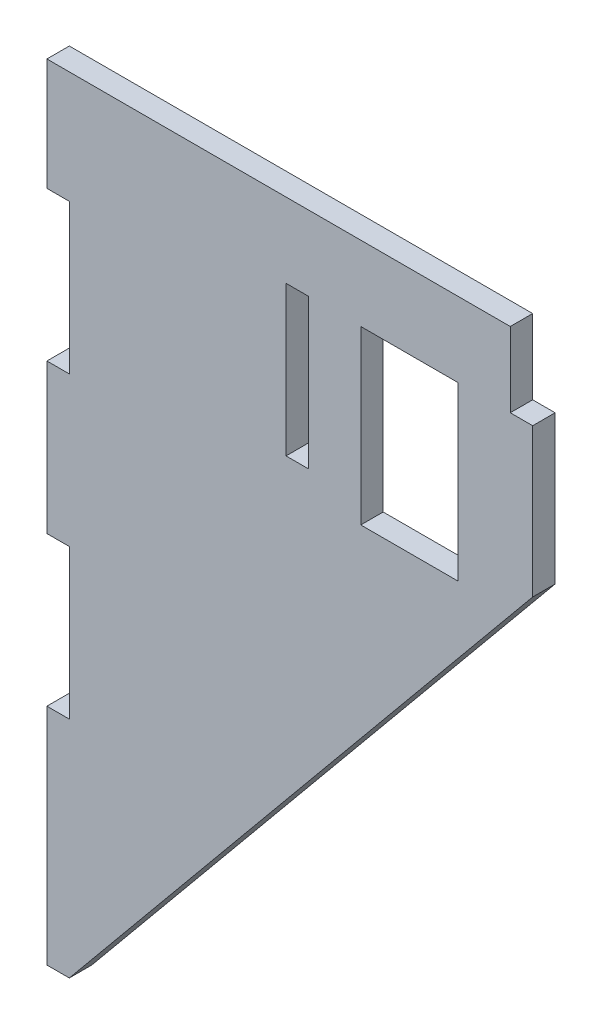
ISO-10303-21;
HEADER;
FILE_DESCRIPTION(('STEP AP214'),'2;1');
FILE_NAME('part.step','',(''),(''),'','','');
FILE_SCHEMA(('AUTOMOTIVE_DESIGN { 1 0 10303 214 1 1 1 1 }'));
ENDSEC;
DATA;
#1=APPLICATION_CONTEXT('core data for automotive mechanical design processes');
#2=APPLICATION_PROTOCOL_DEFINITION('international standard','automotive_design',2000,#1);
#3=PRODUCT_CONTEXT('',#1,'mechanical');
#4=PRODUCT('Part','Part','',(#3));
#5=PRODUCT_RELATED_PRODUCT_CATEGORY('part','',(#4));
#6=PRODUCT_DEFINITION_FORMATION('','',#4);
#7=PRODUCT_DEFINITION_CONTEXT('part definition',#1,'design');
#8=PRODUCT_DEFINITION('design','',#6,#7);
#9=PRODUCT_DEFINITION_SHAPE('','',#8);
#10=(LENGTH_UNIT() NAMED_UNIT(*) SI_UNIT(.MILLI.,.METRE.));
#11=(NAMED_UNIT(*) PLANE_ANGLE_UNIT() SI_UNIT($,.RADIAN.));
#12=(NAMED_UNIT(*) SI_UNIT($,.STERADIAN.) SOLID_ANGLE_UNIT());
#13=UNCERTAINTY_MEASURE_WITH_UNIT(LENGTH_MEASURE(1.E-05),#10,'distance_accuracy_value','');
#14=(GEOMETRIC_REPRESENTATION_CONTEXT(3) GLOBAL_UNCERTAINTY_ASSIGNED_CONTEXT((#13)) GLOBAL_UNIT_ASSIGNED_CONTEXT((#10,
#11,#12)) REPRESENTATION_CONTEXT('',''));
#15=CARTESIAN_POINT('',(0.,0.,0.));
#16=DIRECTION('',(0.,0.,1.));
#17=DIRECTION('',(1.,0.,0.));
#18=AXIS2_PLACEMENT_3D('',#15,#16,#17);
#19=CARTESIAN_POINT('',(0.,0.,3.));
#20=DIRECTION('',(0.,0.,-1.));
#21=DIRECTION('',(-1.,0.,0.));
#22=AXIS2_PLACEMENT_3D('',#19,#20,#21);
#23=PLANE('',#22);
#24=DIRECTION('',(0.,1.,0.));
#25=VECTOR('',#24,1.);
#26=CARTESIAN_POINT('',(32.,75.,3.));
#27=LINE('',#26,#25);
#28=CARTESIAN_POINT('',(32.,75.,3.));
#29=VERTEX_POINT('',#28);
#30=CARTESIAN_POINT('',(32.,95.,3.));
#31=VERTEX_POINT('',#30);
#32=EDGE_CURVE('E223',#29,#31,#27,.T.);
#33=ORIENTED_EDGE('',*,*,#32,.F.);
#34=DIRECTION('',(1.,0.,0.));
#35=VECTOR('',#34,1.);
#36=CARTESIAN_POINT('',(32.,75.,3.));
#37=LINE('',#36,#35);
#38=CARTESIAN_POINT('',(29.,75.,3.));
#39=VERTEX_POINT('',#38);
#40=EDGE_CURVE('E231',#39,#29,#37,.T.);
#41=ORIENTED_EDGE('',*,*,#40,.F.);
#42=DIRECTION('',(0.,-1.,0.));
#43=VECTOR('',#42,1.);
#44=CARTESIAN_POINT('',(29.,75.,3.));
#45=LINE('',#44,#43);
#46=CARTESIAN_POINT('',(29.,95.,3.));
#47=VERTEX_POINT('',#46);
#48=EDGE_CURVE('E228',#47,#39,#45,.T.);
#49=ORIENTED_EDGE('',*,*,#48,.F.);
#50=DIRECTION('',(-1.,0.,0.));
#51=VECTOR('',#50,1.);
#52=CARTESIAN_POINT('',(29.,95.,3.));
#53=LINE('',#52,#51);
#54=EDGE_CURVE('E225',#31,#47,#53,.T.);
#55=ORIENTED_EDGE('',*,*,#54,.F.);
#56=EDGE_LOOP('',(#33,#41,#49,#55));
#57=FACE_BOUND('',#56,.T.);
#58=DIRECTION('',(1.,0.,0.));
#59=VECTOR('',#58,1.);
#60=CARTESIAN_POINT('',(-3.00000000000001,50.,3.));
#61=LINE('',#60,#59);
#62=CARTESIAN_POINT('',(-3.00000000000001,50.,3.));
#63=VERTEX_POINT('',#62);
#64=CARTESIAN_POINT('',(0.,50.,3.));
#65=VERTEX_POINT('',#64);
#66=EDGE_CURVE('E254',#63,#65,#61,.T.);
#67=ORIENTED_EDGE('',*,*,#66,.T.);
#68=DIRECTION('',(0.,-1.,0.));
#69=VECTOR('',#68,1.);
#70=CARTESIAN_POINT('',(0.,50.,3.));
#71=LINE('',#70,#69);
#72=CARTESIAN_POINT('',(0.,30.,3.));
#73=VERTEX_POINT('',#72);
#74=EDGE_CURVE('E257',#65,#73,#71,.T.);
#75=ORIENTED_EDGE('',*,*,#74,.T.);
#76=DIRECTION('',(-1.,0.,0.));
#77=VECTOR('',#76,1.);
#78=CARTESIAN_POINT('',(0.,30.,3.));
#79=LINE('',#78,#77);
#80=CARTESIAN_POINT('',(-3.00000000000001,30.,3.));
#81=VERTEX_POINT('',#80);
#82=EDGE_CURVE('E260',#73,#81,#79,.T.);
#83=ORIENTED_EDGE('',*,*,#82,.T.);
#84=DIRECTION('',(0.,-1.,0.));
#85=VECTOR('',#84,1.);
#86=CARTESIAN_POINT('',(-3.00000000000001,30.,3.));
#87=LINE('',#86,#85);
#88=CARTESIAN_POINT('',(-3.,0.,3.));
#89=VERTEX_POINT('',#88);
#90=EDGE_CURVE('E262',#81,#89,#87,.T.);
#91=ORIENTED_EDGE('',*,*,#90,.T.);
#92=DIRECTION('',(1.,0.,0.));
#93=VECTOR('',#92,1.);
#94=CARTESIAN_POINT('',(-3.,0.,3.));
#95=LINE('',#94,#93);
#96=CARTESIAN_POINT('',(0.,0.,3.));
#97=VERTEX_POINT('',#96);
#98=EDGE_CURVE('E264',#89,#97,#95,.T.);
#99=ORIENTED_EDGE('',*,*,#98,.T.);
#100=DIRECTION('',(0.636382954795564,0.771373278540077,0.));
#101=VECTOR('',#100,1.);
#102=CARTESIAN_POINT('',(0.,0.,3.));
#103=LINE('',#102,#101);
#104=CARTESIAN_POINT('',(62.,75.1515151515151,3.));
#105=VERTEX_POINT('',#104);
#106=EDGE_CURVE('E266',#97,#105,#103,.T.);
#107=ORIENTED_EDGE('',*,*,#106,.T.);
#108=DIRECTION('',(0.,1.,0.));
#109=VECTOR('',#108,1.);
#110=CARTESIAN_POINT('',(62.,94.9999999999999,3.));
#111=LINE('',#110,#109);
#112=CARTESIAN_POINT('',(62.,94.9999999999999,3.));
#113=VERTEX_POINT('',#112);
#114=EDGE_CURVE('E268',#105,#113,#111,.T.);
#115=ORIENTED_EDGE('',*,*,#114,.T.);
#116=DIRECTION('',(-1.,0.,0.));
#117=VECTOR('',#116,1.);
#118=CARTESIAN_POINT('',(59.,94.9999999999999,3.));
#119=LINE('',#118,#117);
#120=CARTESIAN_POINT('',(59.,94.9999999999999,3.));
#121=VERTEX_POINT('',#120);
#122=EDGE_CURVE('E270',#113,#121,#119,.T.);
#123=ORIENTED_EDGE('',*,*,#122,.T.);
#124=DIRECTION('',(0.,1.,0.));
#125=VECTOR('',#124,1.);
#126=CARTESIAN_POINT('',(59.,105.,3.));
#127=LINE('',#126,#125);
#128=CARTESIAN_POINT('',(59.,105.,3.));
#129=VERTEX_POINT('',#128);
#130=EDGE_CURVE('E272',#121,#129,#127,.T.);
#131=ORIENTED_EDGE('',*,*,#130,.T.);
#132=DIRECTION('',(-1.,0.,0.));
#133=VECTOR('',#132,1.);
#134=CARTESIAN_POINT('',(15.,105.,3.));
#135=LINE('',#134,#133);
#136=CARTESIAN_POINT('',(-3.00000000000001,105.,3.));
#137=VERTEX_POINT('',#136);
#138=EDGE_CURVE('E274',#129,#137,#135,.T.);
#139=ORIENTED_EDGE('',*,*,#138,.T.);
#140=DIRECTION('',(0.,-1.,0.));
#141=VECTOR('',#140,1.);
#142=CARTESIAN_POINT('',(-3.00000000000001,90.,3.));
#143=LINE('',#142,#141);
#144=CARTESIAN_POINT('',(-3.00000000000001,90.,3.));
#145=VERTEX_POINT('',#144);
#146=EDGE_CURVE('E276',#137,#145,#143,.T.);
#147=ORIENTED_EDGE('',*,*,#146,.T.);
#148=DIRECTION('',(1.,0.,0.));
#149=VECTOR('',#148,1.);
#150=CARTESIAN_POINT('',(0.,90.,3.));
#151=LINE('',#150,#149);
#152=CARTESIAN_POINT('',(0.,90.,3.));
#153=VERTEX_POINT('',#152);
#154=EDGE_CURVE('E278',#145,#153,#151,.T.);
#155=ORIENTED_EDGE('',*,*,#154,.T.);
#156=DIRECTION('',(0.,-1.,0.));
#157=VECTOR('',#156,1.);
#158=CARTESIAN_POINT('',(0.,70.,3.));
#159=LINE('',#158,#157);
#160=CARTESIAN_POINT('',(0.,70.,3.));
#161=VERTEX_POINT('',#160);
#162=EDGE_CURVE('E280',#153,#161,#159,.T.);
#163=ORIENTED_EDGE('',*,*,#162,.T.);
#164=DIRECTION('',(-1.,0.,0.));
#165=VECTOR('',#164,1.);
#166=CARTESIAN_POINT('',(-3.00000000000001,70.,3.));
#167=LINE('',#166,#165);
#168=CARTESIAN_POINT('',(-3.00000000000001,70.,3.));
#169=VERTEX_POINT('',#168);
#170=EDGE_CURVE('E282',#161,#169,#167,.T.);
#171=ORIENTED_EDGE('',*,*,#170,.T.);
#172=DIRECTION('',(0.,-1.,0.));
#173=VECTOR('',#172,1.);
#174=CARTESIAN_POINT('',(-3.00000000000001,70.,3.));
#175=LINE('',#174,#173);
#176=EDGE_CURVE('E284',#169,#63,#175,.T.);
#177=ORIENTED_EDGE('',*,*,#176,.T.);
#178=EDGE_LOOP('',(#67,#75,#83,#91,#99,#107,#115,#123,#131,#139,#147,#155,#163,#171,#177));
#179=FACE_BOUND('',#178,.T.);
#180=DIRECTION('',(0.,-1.,0.));
#181=VECTOR('',#180,1.);
#182=CARTESIAN_POINT('',(39.,72.,3.));
#183=LINE('',#182,#181);
#184=CARTESIAN_POINT('',(39.,95.,3.));
#185=VERTEX_POINT('',#184);
#186=CARTESIAN_POINT('',(39.,72.,3.));
#187=VERTEX_POINT('',#186);
#188=EDGE_CURVE('E187',#185,#187,#183,.T.);
#189=ORIENTED_EDGE('',*,*,#188,.F.);
#190=DIRECTION('',(-1.,0.,0.));
#191=VECTOR('',#190,1.);
#192=CARTESIAN_POINT('',(39.,95.,3.));
#193=LINE('',#192,#191);
#194=CARTESIAN_POINT('',(52.,95.,3.));
#195=VERTEX_POINT('',#194);
#196=EDGE_CURVE('E209',#195,#185,#193,.T.);
#197=ORIENTED_EDGE('',*,*,#196,.F.);
#198=DIRECTION('',(0.,1.,0.));
#199=VECTOR('',#198,1.);
#200=CARTESIAN_POINT('',(52.,95.,3.));
#201=LINE('',#200,#199);
#202=CARTESIAN_POINT('',(52.,72.,3.));
#203=VERTEX_POINT('',#202);
#204=EDGE_CURVE('E207',#203,#195,#201,.T.);
#205=ORIENTED_EDGE('',*,*,#204,.F.);
#206=DIRECTION('',(1.,0.,0.));
#207=VECTOR('',#206,1.);
#208=CARTESIAN_POINT('',(39.,72.,3.));
#209=LINE('',#208,#207);
#210=EDGE_CURVE('E195',#187,#203,#209,.T.);
#211=ORIENTED_EDGE('',*,*,#210,.F.);
#212=EDGE_LOOP('',(#189,#197,#205,#211));
#213=FACE_BOUND('',#212,.T.);
#214=ADVANCED_FACE('F32',(#57,#179,#213),#23,.F.);
#215=CARTESIAN_POINT('',(0.,0.,0.));
#216=DIRECTION('',(0.,0.,-1.));
#217=DIRECTION('',(-1.,0.,0.));
#218=AXIS2_PLACEMENT_3D('',#215,#216,#217);
#219=PLANE('',#218);
#220=DIRECTION('',(1.,0.,0.));
#221=VECTOR('',#220,1.);
#222=CARTESIAN_POINT('',(-3.00000000000001,50.,0.));
#223=LINE('',#222,#221);
#224=CARTESIAN_POINT('',(-3.00000000000001,50.,0.));
#225=VERTEX_POINT('',#224);
#226=CARTESIAN_POINT('',(0.,50.,0.));
#227=VERTEX_POINT('',#226);
#228=EDGE_CURVE('E253',#225,#227,#223,.T.);
#229=ORIENTED_EDGE('',*,*,#228,.F.);
#230=DIRECTION('',(0.,-1.,0.));
#231=VECTOR('',#230,1.);
#232=CARTESIAN_POINT('',(-3.00000000000001,70.,0.));
#233=LINE('',#232,#231);
#234=CARTESIAN_POINT('',(-3.00000000000001,70.,0.));
#235=VERTEX_POINT('',#234);
#236=EDGE_CURVE('E258',#235,#225,#233,.T.);
#237=ORIENTED_EDGE('',*,*,#236,.F.);
#238=DIRECTION('',(-1.,0.,0.));
#239=VECTOR('',#238,1.);
#240=CARTESIAN_POINT('',(-3.00000000000001,70.,0.));
#241=LINE('',#240,#239);
#242=CARTESIAN_POINT('',(0.,70.,0.));
#243=VERTEX_POINT('',#242);
#244=EDGE_CURVE('E314',#243,#235,#241,.T.);
#245=ORIENTED_EDGE('',*,*,#244,.F.);
#246=DIRECTION('',(0.,-1.,0.));
#247=VECTOR('',#246,1.);
#248=CARTESIAN_POINT('',(0.,70.,0.));
#249=LINE('',#248,#247);
#250=CARTESIAN_POINT('',(0.,90.,0.));
#251=VERTEX_POINT('',#250);
#252=EDGE_CURVE('E312',#251,#243,#249,.T.);
#253=ORIENTED_EDGE('',*,*,#252,.F.);
#254=DIRECTION('',(1.,0.,0.));
#255=VECTOR('',#254,1.);
#256=CARTESIAN_POINT('',(0.,90.,0.));
#257=LINE('',#256,#255);
#258=CARTESIAN_POINT('',(-3.00000000000001,90.,0.));
#259=VERTEX_POINT('',#258);
#260=EDGE_CURVE('E310',#259,#251,#257,.T.);
#261=ORIENTED_EDGE('',*,*,#260,.F.);
#262=DIRECTION('',(0.,-1.,0.));
#263=VECTOR('',#262,1.);
#264=CARTESIAN_POINT('',(-3.00000000000001,90.,0.));
#265=LINE('',#264,#263);
#266=CARTESIAN_POINT('',(-3.00000000000001,105.,0.));
#267=VERTEX_POINT('',#266);
#268=EDGE_CURVE('E308',#267,#259,#265,.T.);
#269=ORIENTED_EDGE('',*,*,#268,.F.);
#270=DIRECTION('',(-1.,0.,0.));
#271=VECTOR('',#270,1.);
#272=CARTESIAN_POINT('',(-3.00000000000001,105.,0.));
#273=LINE('',#272,#271);
#274=CARTESIAN_POINT('',(59.,105.,0.));
#275=VERTEX_POINT('',#274);
#276=EDGE_CURVE('E306',#275,#267,#273,.T.);
#277=ORIENTED_EDGE('',*,*,#276,.F.);
#278=DIRECTION('',(0.,1.,0.));
#279=VECTOR('',#278,1.);
#280=CARTESIAN_POINT('',(59.,105.,0.));
#281=LINE('',#280,#279);
#282=CARTESIAN_POINT('',(59.,94.9999999999999,0.));
#283=VERTEX_POINT('',#282);
#284=EDGE_CURVE('E303',#283,#275,#281,.T.);
#285=ORIENTED_EDGE('',*,*,#284,.F.);
#286=DIRECTION('',(-1.,0.,0.));
#287=VECTOR('',#286,1.);
#288=CARTESIAN_POINT('',(59.,94.9999999999999,0.));
#289=LINE('',#288,#287);
#290=CARTESIAN_POINT('',(62.,94.9999999999999,0.));
#291=VERTEX_POINT('',#290);
#292=EDGE_CURVE('E301',#291,#283,#289,.T.);
#293=ORIENTED_EDGE('',*,*,#292,.F.);
#294=DIRECTION('',(0.,1.,0.));
#295=VECTOR('',#294,1.);
#296=CARTESIAN_POINT('',(62.,94.9999999999999,0.));
#297=LINE('',#296,#295);
#298=CARTESIAN_POINT('',(62.,75.1515151515151,0.));
#299=VERTEX_POINT('',#298);
#300=EDGE_CURVE('E299',#299,#291,#297,.T.);
#301=ORIENTED_EDGE('',*,*,#300,.F.);
#302=DIRECTION('',(0.636382954795564,0.771373278540077,0.));
#303=VECTOR('',#302,1.);
#304=CARTESIAN_POINT('',(0.,0.,0.));
#305=LINE('',#304,#303);
#306=CARTESIAN_POINT('',(0.,0.,0.));
#307=VERTEX_POINT('',#306);
#308=EDGE_CURVE('E297',#307,#299,#305,.T.);
#309=ORIENTED_EDGE('',*,*,#308,.F.);
#310=DIRECTION('',(1.,0.,0.));
#311=VECTOR('',#310,1.);
#312=CARTESIAN_POINT('',(-3.,0.,0.));
#313=LINE('',#312,#311);
#314=CARTESIAN_POINT('',(-3.,0.,0.));
#315=VERTEX_POINT('',#314);
#316=EDGE_CURVE('E295',#315,#307,#313,.T.);
#317=ORIENTED_EDGE('',*,*,#316,.F.);
#318=DIRECTION('',(0.,-1.,0.));
#319=VECTOR('',#318,1.);
#320=CARTESIAN_POINT('',(-3.00000000000001,30.,0.));
#321=LINE('',#320,#319);
#322=CARTESIAN_POINT('',(-3.00000000000001,30.,0.));
#323=VERTEX_POINT('',#322);
#324=EDGE_CURVE('E293',#323,#315,#321,.T.);
#325=ORIENTED_EDGE('',*,*,#324,.F.);
#326=DIRECTION('',(-1.,0.,0.));
#327=VECTOR('',#326,1.);
#328=CARTESIAN_POINT('',(0.,30.,0.));
#329=LINE('',#328,#327);
#330=CARTESIAN_POINT('',(0.,30.,0.));
#331=VERTEX_POINT('',#330);
#332=EDGE_CURVE('E291',#331,#323,#329,.T.);
#333=ORIENTED_EDGE('',*,*,#332,.F.);
#334=DIRECTION('',(0.,-1.,0.));
#335=VECTOR('',#334,1.);
#336=CARTESIAN_POINT('',(0.,50.,0.));
#337=LINE('',#336,#335);
#338=EDGE_CURVE('E289',#227,#331,#337,.T.);
#339=ORIENTED_EDGE('',*,*,#338,.F.);
#340=EDGE_LOOP('',(#229,#237,#245,#253,#261,#269,#277,#285,#293,#301,#309,#317,#325,#333,#339));
#341=FACE_BOUND('',#340,.T.);
#342=DIRECTION('',(1.,0.,0.));
#343=VECTOR('',#342,1.);
#344=CARTESIAN_POINT('',(32.,75.,0.));
#345=LINE('',#344,#343);
#346=CARTESIAN_POINT('',(29.,75.,0.));
#347=VERTEX_POINT('',#346);
#348=CARTESIAN_POINT('',(32.,75.,0.));
#349=VERTEX_POINT('',#348);
#350=EDGE_CURVE('E226',#347,#349,#345,.T.);
#351=ORIENTED_EDGE('',*,*,#350,.T.);
#352=DIRECTION('',(0.,1.,0.));
#353=VECTOR('',#352,1.);
#354=CARTESIAN_POINT('',(32.,75.,0.));
#355=LINE('',#354,#353);
#356=CARTESIAN_POINT('',(32.,95.,0.));
#357=VERTEX_POINT('',#356);
#358=EDGE_CURVE('E203',#349,#357,#355,.T.);
#359=ORIENTED_EDGE('',*,*,#358,.T.);
#360=DIRECTION('',(-1.,0.,0.));
#361=VECTOR('',#360,1.);
#362=CARTESIAN_POINT('',(29.,95.,0.));
#363=LINE('',#362,#361);
#364=CARTESIAN_POINT('',(29.,95.,0.));
#365=VERTEX_POINT('',#364);
#366=EDGE_CURVE('E236',#357,#365,#363,.T.);
#367=ORIENTED_EDGE('',*,*,#366,.T.);
#368=DIRECTION('',(0.,-1.,0.));
#369=VECTOR('',#368,1.);
#370=CARTESIAN_POINT('',(29.,75.,0.));
#371=LINE('',#370,#369);
#372=EDGE_CURVE('E239',#365,#347,#371,.T.);
#373=ORIENTED_EDGE('',*,*,#372,.T.);
#374=EDGE_LOOP('',(#351,#359,#367,#373));
#375=FACE_BOUND('',#374,.T.);
#376=DIRECTION('',(-1.,0.,0.));
#377=VECTOR('',#376,1.);
#378=CARTESIAN_POINT('',(39.,95.,0.));
#379=LINE('',#378,#377);
#380=CARTESIAN_POINT('',(52.,95.,0.));
#381=VERTEX_POINT('',#380);
#382=CARTESIAN_POINT('',(39.,95.,0.));
#383=VERTEX_POINT('',#382);
#384=EDGE_CURVE('E196',#381,#383,#379,.T.);
#385=ORIENTED_EDGE('',*,*,#384,.T.);
#386=DIRECTION('',(0.,-1.,0.));
#387=VECTOR('',#386,1.);
#388=CARTESIAN_POINT('',(39.,72.,0.));
#389=LINE('',#388,#387);
#390=CARTESIAN_POINT('',(39.,72.,0.));
#391=VERTEX_POINT('',#390);
#392=EDGE_CURVE('E55',#383,#391,#389,.T.);
#393=ORIENTED_EDGE('',*,*,#392,.T.);
#394=DIRECTION('',(1.,0.,0.));
#395=VECTOR('',#394,1.);
#396=CARTESIAN_POINT('',(39.,72.,0.));
#397=LINE('',#396,#395);
#398=CARTESIAN_POINT('',(52.,72.,0.));
#399=VERTEX_POINT('',#398);
#400=EDGE_CURVE('E202',#391,#399,#397,.T.);
#401=ORIENTED_EDGE('',*,*,#400,.T.);
#402=DIRECTION('',(0.,1.,0.));
#403=VECTOR('',#402,1.);
#404=CARTESIAN_POINT('',(52.,95.,0.));
#405=LINE('',#404,#403);
#406=EDGE_CURVE('E215',#399,#381,#405,.T.);
#407=ORIENTED_EDGE('',*,*,#406,.T.);
#408=EDGE_LOOP('',(#385,#393,#401,#407));
#409=FACE_BOUND('',#408,.T.);
#410=ADVANCED_FACE('F365',(#341,#375,#409),#219,.T.);
#411=CARTESIAN_POINT('',(-3.00000000000001,50.,3.));
#412=DIRECTION('',(0.,1.,0.));
#413=DIRECTION('',(0.,0.,1.));
#414=AXIS2_PLACEMENT_3D('',#411,#412,#413);
#415=PLANE('',#414);
#416=ORIENTED_EDGE('',*,*,#228,.T.);
#417=DIRECTION('',(0.,0.,-1.));
#418=VECTOR('',#417,1.);
#419=CARTESIAN_POINT('',(0.,50.,3.));
#420=LINE('',#419,#418);
#421=EDGE_CURVE('E11',#65,#227,#420,.T.);
#422=ORIENTED_EDGE('',*,*,#421,.F.);
#423=ORIENTED_EDGE('',*,*,#66,.F.);
#424=DIRECTION('',(0.,0.,-1.));
#425=VECTOR('',#424,1.);
#426=CARTESIAN_POINT('',(-3.00000000000001,50.,3.));
#427=LINE('',#426,#425);
#428=EDGE_CURVE('E286',#63,#225,#427,.T.);
#429=ORIENTED_EDGE('',*,*,#428,.T.);
#430=EDGE_LOOP('',(#416,#422,#423,#429));
#431=FACE_BOUND('',#430,.T.);
#432=ADVANCED_FACE('F34',(#431),#415,.F.);
#433=CARTESIAN_POINT('',(0.,50.,3.));
#434=DIRECTION('',(1.,0.,0.));
#435=DIRECTION('',(0.,0.,-1.));
#436=AXIS2_PLACEMENT_3D('',#433,#434,#435);
#437=PLANE('',#436);
#438=ORIENTED_EDGE('',*,*,#338,.T.);
#439=DIRECTION('',(0.,0.,-1.));
#440=VECTOR('',#439,1.);
#441=CARTESIAN_POINT('',(0.,30.,3.));
#442=LINE('',#441,#440);
#443=EDGE_CURVE('E40',#73,#331,#442,.T.);
#444=ORIENTED_EDGE('',*,*,#443,.F.);
#445=ORIENTED_EDGE('',*,*,#74,.F.);
#446=ORIENTED_EDGE('',*,*,#421,.T.);
#447=EDGE_LOOP('',(#438,#444,#445,#446));
#448=FACE_BOUND('',#447,.T.);
#449=ADVANCED_FACE('F382',(#448),#437,.F.);
#450=CARTESIAN_POINT('',(0.,30.,3.));
#451=DIRECTION('',(0.,-1.,0.));
#452=DIRECTION('',(0.,0.,-1.));
#453=AXIS2_PLACEMENT_3D('',#450,#451,#452);
#454=PLANE('',#453);
#455=ORIENTED_EDGE('',*,*,#332,.T.);
#456=DIRECTION('',(0.,0.,-1.));
#457=VECTOR('',#456,1.);
#458=CARTESIAN_POINT('',(-3.00000000000001,30.,3.));
#459=LINE('',#458,#457);
#460=EDGE_CURVE('E352',#81,#323,#459,.T.);
#461=ORIENTED_EDGE('',*,*,#460,.F.);
#462=ORIENTED_EDGE('',*,*,#82,.F.);
#463=ORIENTED_EDGE('',*,*,#443,.T.);
#464=EDGE_LOOP('',(#455,#461,#462,#463));
#465=FACE_BOUND('',#464,.T.);
#466=ADVANCED_FACE('F359',(#465),#454,.F.);
#467=CARTESIAN_POINT('',(-3.00000000000001,30.,3.));
#468=DIRECTION('',(1.,0.,0.));
#469=DIRECTION('',(0.,1.,0.));
#470=AXIS2_PLACEMENT_3D('',#467,#468,#469);
#471=PLANE('',#470);
#472=ORIENTED_EDGE('',*,*,#324,.T.);
#473=DIRECTION('',(0.,0.,-1.));
#474=VECTOR('',#473,1.);
#475=CARTESIAN_POINT('',(-3.,0.,3.));
#476=LINE('',#475,#474);
#477=EDGE_CURVE('E349',#89,#315,#476,.T.);
#478=ORIENTED_EDGE('',*,*,#477,.F.);
#479=ORIENTED_EDGE('',*,*,#90,.F.);
#480=ORIENTED_EDGE('',*,*,#460,.T.);
#481=EDGE_LOOP('',(#472,#478,#479,#480));
#482=FACE_BOUND('',#481,.T.);
#483=ADVANCED_FACE('F371',(#482),#471,.F.);
#484=CARTESIAN_POINT('',(-3.,0.,3.));
#485=DIRECTION('',(0.,1.,0.));
#486=DIRECTION('',(0.,0.,1.));
#487=AXIS2_PLACEMENT_3D('',#484,#485,#486);
#488=PLANE('',#487);
#489=ORIENTED_EDGE('',*,*,#316,.T.);
#490=DIRECTION('',(0.,0.,-1.));
#491=VECTOR('',#490,1.);
#492=CARTESIAN_POINT('',(0.,0.,3.));
#493=LINE('',#492,#491);
#494=EDGE_CURVE('E346',#97,#307,#493,.T.);
#495=ORIENTED_EDGE('',*,*,#494,.F.);
#496=ORIENTED_EDGE('',*,*,#98,.F.);
#497=ORIENTED_EDGE('',*,*,#477,.T.);
#498=EDGE_LOOP('',(#489,#495,#496,#497));
#499=FACE_BOUND('',#498,.T.);
#500=ADVANCED_FACE('F375',(#499),#488,.F.);
#501=CARTESIAN_POINT('',(0.,0.,3.));
#502=DIRECTION('',(-0.771373278540077,0.636382954795564,0.));
#503=DIRECTION('',(-0.636382954795564,-0.771373278540077,0.));
#504=AXIS2_PLACEMENT_3D('',#501,#502,#503);
#505=PLANE('',#504);
#506=ORIENTED_EDGE('',*,*,#308,.T.);
#507=DIRECTION('',(0.,0.,-1.));
#508=VECTOR('',#507,1.);
#509=CARTESIAN_POINT('',(62.,75.1515151515151,3.));
#510=LINE('',#509,#508);
#511=EDGE_CURVE('E343',#105,#299,#510,.T.);
#512=ORIENTED_EDGE('',*,*,#511,.F.);
#513=ORIENTED_EDGE('',*,*,#106,.F.);
#514=ORIENTED_EDGE('',*,*,#494,.T.);
#515=EDGE_LOOP('',(#506,#512,#513,#514));
#516=FACE_BOUND('',#515,.T.);
#517=ADVANCED_FACE('F429',(#516),#505,.F.);
#518=CARTESIAN_POINT('',(62.,94.9999999999999,3.));
#519=DIRECTION('',(-1.,0.,0.));
#520=DIRECTION('',(0.,-1.,0.));
#521=AXIS2_PLACEMENT_3D('',#518,#519,#520);
#522=PLANE('',#521);
#523=ORIENTED_EDGE('',*,*,#300,.T.);
#524=DIRECTION('',(0.,0.,-1.));
#525=VECTOR('',#524,1.);
#526=CARTESIAN_POINT('',(62.,94.9999999999999,3.));
#527=LINE('',#526,#525);
#528=EDGE_CURVE('E340',#113,#291,#527,.T.);
#529=ORIENTED_EDGE('',*,*,#528,.F.);
#530=ORIENTED_EDGE('',*,*,#114,.F.);
#531=ORIENTED_EDGE('',*,*,#511,.T.);
#532=EDGE_LOOP('',(#523,#529,#530,#531));
#533=FACE_BOUND('',#532,.T.);
#534=ADVANCED_FACE('F426',(#533),#522,.F.);
#535=CARTESIAN_POINT('',(59.,94.9999999999999,3.));
#536=DIRECTION('',(0.,-1.,0.));
#537=DIRECTION('',(0.,0.,-1.));
#538=AXIS2_PLACEMENT_3D('',#535,#536,#537);
#539=PLANE('',#538);
#540=ORIENTED_EDGE('',*,*,#292,.T.);
#541=DIRECTION('',(0.,0.,-1.));
#542=VECTOR('',#541,1.);
#543=CARTESIAN_POINT('',(59.,94.9999999999999,3.));
#544=LINE('',#543,#542);
#545=EDGE_CURVE('E337',#121,#283,#544,.T.);
#546=ORIENTED_EDGE('',*,*,#545,.F.);
#547=ORIENTED_EDGE('',*,*,#122,.F.);
#548=ORIENTED_EDGE('',*,*,#528,.T.);
#549=EDGE_LOOP('',(#540,#546,#547,#548));
#550=FACE_BOUND('',#549,.T.);
#551=ADVANCED_FACE('F422',(#550),#539,.F.);
#552=CARTESIAN_POINT('',(59.,105.,3.));
#553=DIRECTION('',(-1.,0.,0.));
#554=DIRECTION('',(0.,-1.,0.));
#555=AXIS2_PLACEMENT_3D('',#552,#553,#554);
#556=PLANE('',#555);
#557=ORIENTED_EDGE('',*,*,#284,.T.);
#558=DIRECTION('',(0.,0.,-1.));
#559=VECTOR('',#558,1.);
#560=CARTESIAN_POINT('',(59.,105.,3.));
#561=LINE('',#560,#559);
#562=EDGE_CURVE('E334',#129,#275,#561,.T.);
#563=ORIENTED_EDGE('',*,*,#562,.F.);
#564=ORIENTED_EDGE('',*,*,#130,.F.);
#565=ORIENTED_EDGE('',*,*,#545,.T.);
#566=EDGE_LOOP('',(#557,#563,#564,#565));
#567=FACE_BOUND('',#566,.T.);
#568=ADVANCED_FACE('F417',(#567),#556,.F.);
#569=CARTESIAN_POINT('',(-3.00000000000001,105.,3.));
#570=DIRECTION('',(0.,-1.,0.));
#571=DIRECTION('',(0.,0.,-1.));
#572=AXIS2_PLACEMENT_3D('',#569,#570,#571);
#573=PLANE('',#572);
#574=ORIENTED_EDGE('',*,*,#276,.T.);
#575=DIRECTION('',(0.,0.,-1.));
#576=VECTOR('',#575,1.);
#577=CARTESIAN_POINT('',(-3.00000000000001,105.,3.));
#578=LINE('',#577,#576);
#579=EDGE_CURVE('E331',#137,#267,#578,.T.);
#580=ORIENTED_EDGE('',*,*,#579,.F.);
#581=ORIENTED_EDGE('',*,*,#138,.F.);
#582=ORIENTED_EDGE('',*,*,#562,.T.);
#583=EDGE_LOOP('',(#574,#580,#581,#582));
#584=FACE_BOUND('',#583,.T.);
#585=ADVANCED_FACE('F412',(#584),#573,.F.);
#586=CARTESIAN_POINT('',(-3.00000000000001,90.,3.));
#587=DIRECTION('',(1.,0.,0.));
#588=DIRECTION('',(0.,0.,-1.));
#589=AXIS2_PLACEMENT_3D('',#586,#587,#588);
#590=PLANE('',#589);
#591=ORIENTED_EDGE('',*,*,#268,.T.);
#592=DIRECTION('',(0.,0.,-1.));
#593=VECTOR('',#592,1.);
#594=CARTESIAN_POINT('',(-3.00000000000001,90.,3.));
#595=LINE('',#594,#593);
#596=EDGE_CURVE('E328',#145,#259,#595,.T.);
#597=ORIENTED_EDGE('',*,*,#596,.F.);
#598=ORIENTED_EDGE('',*,*,#146,.F.);
#599=ORIENTED_EDGE('',*,*,#579,.T.);
#600=EDGE_LOOP('',(#591,#597,#598,#599));
#601=FACE_BOUND('',#600,.T.);
#602=ADVANCED_FACE('F408',(#601),#590,.F.);
#603=CARTESIAN_POINT('',(0.,90.,3.));
#604=DIRECTION('',(0.,1.,0.));
#605=DIRECTION('',(0.,0.,1.));
#606=AXIS2_PLACEMENT_3D('',#603,#604,#605);
#607=PLANE('',#606);
#608=ORIENTED_EDGE('',*,*,#260,.T.);
#609=DIRECTION('',(0.,0.,-1.));
#610=VECTOR('',#609,1.);
#611=CARTESIAN_POINT('',(0.,90.,3.));
#612=LINE('',#611,#610);
#613=EDGE_CURVE('E325',#153,#251,#612,.T.);
#614=ORIENTED_EDGE('',*,*,#613,.F.);
#615=ORIENTED_EDGE('',*,*,#154,.F.);
#616=ORIENTED_EDGE('',*,*,#596,.T.);
#617=EDGE_LOOP('',(#608,#614,#615,#616));
#618=FACE_BOUND('',#617,.T.);
#619=ADVANCED_FACE('F403',(#618),#607,.F.);
#620=CARTESIAN_POINT('',(0.,70.,3.));
#621=DIRECTION('',(1.,0.,0.));
#622=DIRECTION('',(0.,0.,-1.));
#623=AXIS2_PLACEMENT_3D('',#620,#621,#622);
#624=PLANE('',#623);
#625=ORIENTED_EDGE('',*,*,#252,.T.);
#626=DIRECTION('',(0.,0.,-1.));
#627=VECTOR('',#626,1.);
#628=CARTESIAN_POINT('',(0.,70.,3.));
#629=LINE('',#628,#627);
#630=EDGE_CURVE('E322',#161,#243,#629,.T.);
#631=ORIENTED_EDGE('',*,*,#630,.F.);
#632=ORIENTED_EDGE('',*,*,#162,.F.);
#633=ORIENTED_EDGE('',*,*,#613,.T.);
#634=EDGE_LOOP('',(#625,#631,#632,#633));
#635=FACE_BOUND('',#634,.T.);
#636=ADVANCED_FACE('F398',(#635),#624,.F.);
#637=CARTESIAN_POINT('',(-3.00000000000001,70.,3.));
#638=DIRECTION('',(0.,-1.,0.));
#639=DIRECTION('',(0.,0.,-1.));
#640=AXIS2_PLACEMENT_3D('',#637,#638,#639);
#641=PLANE('',#640);
#642=ORIENTED_EDGE('',*,*,#244,.T.);
#643=DIRECTION('',(0.,0.,-1.));
#644=VECTOR('',#643,1.);
#645=CARTESIAN_POINT('',(-3.00000000000001,70.,3.));
#646=LINE('',#645,#644);
#647=EDGE_CURVE('E319',#169,#235,#646,.T.);
#648=ORIENTED_EDGE('',*,*,#647,.F.);
#649=ORIENTED_EDGE('',*,*,#170,.F.);
#650=ORIENTED_EDGE('',*,*,#630,.T.);
#651=EDGE_LOOP('',(#642,#648,#649,#650));
#652=FACE_BOUND('',#651,.T.);
#653=ADVANCED_FACE('F394',(#652),#641,.F.);
#654=CARTESIAN_POINT('',(-3.00000000000001,70.,3.));
#655=DIRECTION('',(1.,0.,0.));
#656=DIRECTION('',(0.,1.,0.));
#657=AXIS2_PLACEMENT_3D('',#654,#655,#656);
#658=PLANE('',#657);
#659=ORIENTED_EDGE('',*,*,#236,.T.);
#660=ORIENTED_EDGE('',*,*,#428,.F.);
#661=ORIENTED_EDGE('',*,*,#176,.F.);
#662=ORIENTED_EDGE('',*,*,#647,.T.);
#663=EDGE_LOOP('',(#659,#660,#661,#662));
#664=FACE_BOUND('',#663,.T.);
#665=ADVANCED_FACE('F389',(#664),#658,.F.);
#666=CARTESIAN_POINT('',(32.,75.,3.));
#667=DIRECTION('',(-1.,0.,0.));
#668=DIRECTION('',(0.,-1.,0.));
#669=AXIS2_PLACEMENT_3D('',#666,#667,#668);
#670=PLANE('',#669);
#671=ORIENTED_EDGE('',*,*,#358,.F.);
#672=DIRECTION('',(0.,0.,-1.));
#673=VECTOR('',#672,1.);
#674=CARTESIAN_POINT('',(32.,75.,3.));
#675=LINE('',#674,#673);
#676=EDGE_CURVE('E233',#29,#349,#675,.T.);
#677=ORIENTED_EDGE('',*,*,#676,.F.);
#678=ORIENTED_EDGE('',*,*,#32,.T.);
#679=DIRECTION('',(0.,0.,-1.));
#680=VECTOR('',#679,1.);
#681=CARTESIAN_POINT('',(32.,95.,3.));
#682=LINE('',#681,#680);
#683=EDGE_CURVE('E250',#31,#357,#682,.T.);
#684=ORIENTED_EDGE('',*,*,#683,.T.);
#685=EDGE_LOOP('',(#671,#677,#678,#684));
#686=FACE_BOUND('',#685,.T.);
#687=ADVANCED_FACE('F447',(#686),#670,.T.);
#688=CARTESIAN_POINT('',(29.,95.,3.));
#689=DIRECTION('',(0.,-1.,0.));
#690=DIRECTION('',(0.,0.,-1.));
#691=AXIS2_PLACEMENT_3D('',#688,#689,#690);
#692=PLANE('',#691);
#693=ORIENTED_EDGE('',*,*,#366,.F.);
#694=ORIENTED_EDGE('',*,*,#683,.F.);
#695=ORIENTED_EDGE('',*,*,#54,.T.);
#696=DIRECTION('',(0.,0.,-1.));
#697=VECTOR('',#696,1.);
#698=CARTESIAN_POINT('',(29.,95.,3.));
#699=LINE('',#698,#697);
#700=EDGE_CURVE('E248',#47,#365,#699,.T.);
#701=ORIENTED_EDGE('',*,*,#700,.T.);
#702=EDGE_LOOP('',(#693,#694,#695,#701));
#703=FACE_BOUND('',#702,.T.);
#704=ADVANCED_FACE('F503',(#703),#692,.T.);
#705=CARTESIAN_POINT('',(29.,75.,3.));
#706=DIRECTION('',(1.,0.,0.));
#707=DIRECTION('',(0.,1.,0.));
#708=AXIS2_PLACEMENT_3D('',#705,#706,#707);
#709=PLANE('',#708);
#710=ORIENTED_EDGE('',*,*,#372,.F.);
#711=ORIENTED_EDGE('',*,*,#700,.F.);
#712=ORIENTED_EDGE('',*,*,#48,.T.);
#713=DIRECTION('',(0.,0.,-1.));
#714=VECTOR('',#713,1.);
#715=CARTESIAN_POINT('',(29.,75.,3.));
#716=LINE('',#715,#714);
#717=EDGE_CURVE('E246',#39,#347,#716,.T.);
#718=ORIENTED_EDGE('',*,*,#717,.T.);
#719=EDGE_LOOP('',(#710,#711,#712,#718));
#720=FACE_BOUND('',#719,.T.);
#721=ADVANCED_FACE('F510',(#720),#709,.T.);
#722=CARTESIAN_POINT('',(32.,75.,3.));
#723=DIRECTION('',(0.,1.,0.));
#724=DIRECTION('',(0.,0.,1.));
#725=AXIS2_PLACEMENT_3D('',#722,#723,#724);
#726=PLANE('',#725);
#727=ORIENTED_EDGE('',*,*,#350,.F.);
#728=ORIENTED_EDGE('',*,*,#717,.F.);
#729=ORIENTED_EDGE('',*,*,#40,.T.);
#730=ORIENTED_EDGE('',*,*,#676,.T.);
#731=EDGE_LOOP('',(#727,#728,#729,#730));
#732=FACE_BOUND('',#731,.T.);
#733=ADVANCED_FACE('F517',(#732),#726,.T.);
#734=CARTESIAN_POINT('',(39.,72.,3.));
#735=DIRECTION('',(1.,0.,0.));
#736=DIRECTION('',(0.,1.,0.));
#737=AXIS2_PLACEMENT_3D('',#734,#735,#736);
#738=PLANE('',#737);
#739=ORIENTED_EDGE('',*,*,#392,.F.);
#740=DIRECTION('',(0.,0.,-1.));
#741=VECTOR('',#740,1.);
#742=CARTESIAN_POINT('',(39.,95.,3.));
#743=LINE('',#742,#741);
#744=EDGE_CURVE('E191',#185,#383,#743,.T.);
#745=ORIENTED_EDGE('',*,*,#744,.F.);
#746=ORIENTED_EDGE('',*,*,#188,.T.);
#747=DIRECTION('',(0.,0.,-1.));
#748=VECTOR('',#747,1.);
#749=CARTESIAN_POINT('',(39.,72.,3.));
#750=LINE('',#749,#748);
#751=EDGE_CURVE('E190',#187,#391,#750,.T.);
#752=ORIENTED_EDGE('',*,*,#751,.T.);
#753=EDGE_LOOP('',(#739,#745,#746,#752));
#754=FACE_BOUND('',#753,.T.);
#755=ADVANCED_FACE('F189',(#754),#738,.T.);
#756=CARTESIAN_POINT('',(39.,72.,3.));
#757=DIRECTION('',(0.,1.,0.));
#758=DIRECTION('',(0.,0.,1.));
#759=AXIS2_PLACEMENT_3D('',#756,#757,#758);
#760=PLANE('',#759);
#761=ORIENTED_EDGE('',*,*,#400,.F.);
#762=ORIENTED_EDGE('',*,*,#751,.F.);
#763=ORIENTED_EDGE('',*,*,#210,.T.);
#764=DIRECTION('',(0.,0.,-1.));
#765=VECTOR('',#764,1.);
#766=CARTESIAN_POINT('',(52.,72.,3.));
#767=LINE('',#766,#765);
#768=EDGE_CURVE('E204',#203,#399,#767,.T.);
#769=ORIENTED_EDGE('',*,*,#768,.T.);
#770=EDGE_LOOP('',(#761,#762,#763,#769));
#771=FACE_BOUND('',#770,.T.);
#772=ADVANCED_FACE('F199',(#771),#760,.T.);
#773=CARTESIAN_POINT('',(52.,95.,3.));
#774=DIRECTION('',(-1.,0.,0.));
#775=DIRECTION('',(0.,-1.,0.));
#776=AXIS2_PLACEMENT_3D('',#773,#774,#775);
#777=PLANE('',#776);
#778=ORIENTED_EDGE('',*,*,#406,.F.);
#779=ORIENTED_EDGE('',*,*,#768,.F.);
#780=ORIENTED_EDGE('',*,*,#204,.T.);
#781=DIRECTION('',(0.,0.,-1.));
#782=VECTOR('',#781,1.);
#783=CARTESIAN_POINT('',(52.,95.,3.));
#784=LINE('',#783,#782);
#785=EDGE_CURVE('E47',#195,#381,#784,.T.);
#786=ORIENTED_EDGE('',*,*,#785,.T.);
#787=EDGE_LOOP('',(#778,#779,#780,#786));
#788=FACE_BOUND('',#787,.T.);
#789=ADVANCED_FACE('F538',(#788),#777,.T.);
#790=CARTESIAN_POINT('',(39.,95.,3.));
#791=DIRECTION('',(0.,-1.,0.));
#792=DIRECTION('',(0.,0.,-1.));
#793=AXIS2_PLACEMENT_3D('',#790,#791,#792);
#794=PLANE('',#793);
#795=ORIENTED_EDGE('',*,*,#384,.F.);
#796=ORIENTED_EDGE('',*,*,#785,.F.);
#797=ORIENTED_EDGE('',*,*,#196,.T.);
#798=ORIENTED_EDGE('',*,*,#744,.T.);
#799=EDGE_LOOP('',(#795,#796,#797,#798));
#800=FACE_BOUND('',#799,.T.);
#801=ADVANCED_FACE('F545',(#800),#794,.T.);
#802=CLOSED_SHELL('',(#214,#410,#432,#449,#466,#483,#500,#517,#534,#551,#568,#585,#602,#619,
#636,#653,#665,#687,#704,#721,#733,#755,#772,#789,#801));
#803=MANIFOLD_SOLID_BREP('B2',#802);
#804=ADVANCED_BREP_SHAPE_REPRESENTATION('',(#18,#803),#14);
#805=SHAPE_DEFINITION_REPRESENTATION(#9,#804);
ENDSEC;
END-ISO-10303-21;
